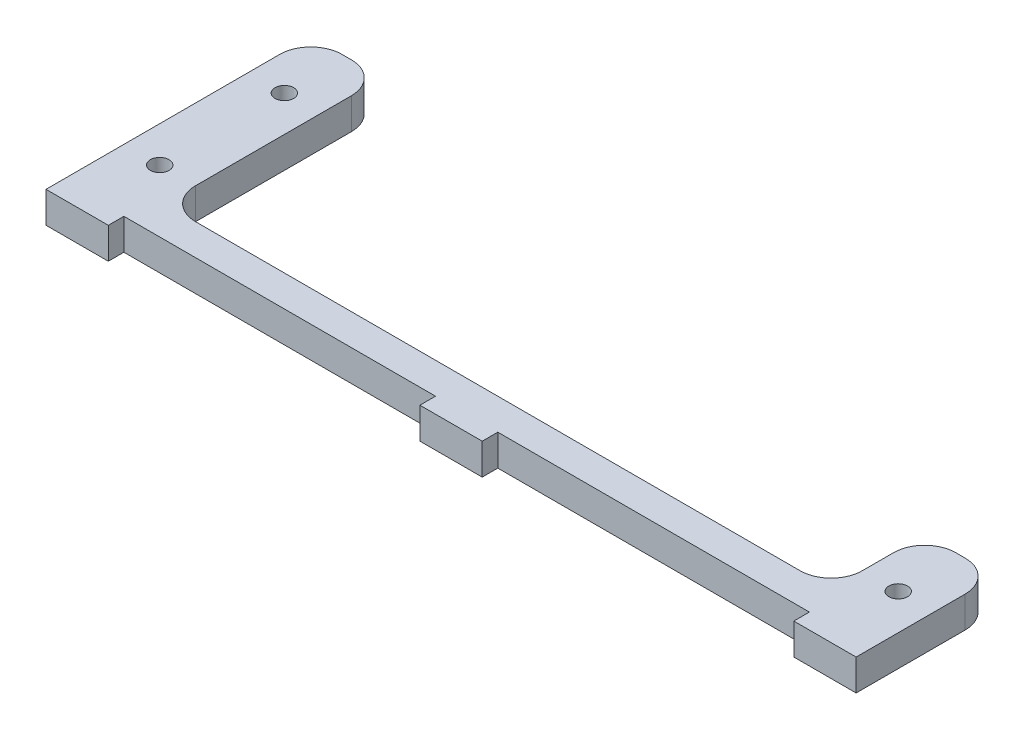
ISO-10303-21;
HEADER;
FILE_DESCRIPTION(('STEP AP214'),'2;1');
FILE_NAME('part.step','',(''),(''),'','','');
FILE_SCHEMA(('AUTOMOTIVE_DESIGN { 1 0 10303 214 1 1 1 1 }'));
ENDSEC;
DATA;
#1=APPLICATION_CONTEXT('core data for automotive mechanical design processes');
#2=APPLICATION_PROTOCOL_DEFINITION('international standard','automotive_design',2000,#1);
#3=PRODUCT_CONTEXT('',#1,'mechanical');
#4=PRODUCT('Part','Part','',(#3));
#5=PRODUCT_RELATED_PRODUCT_CATEGORY('part','',(#4));
#6=PRODUCT_DEFINITION_FORMATION('','',#4);
#7=PRODUCT_DEFINITION_CONTEXT('part definition',#1,'design');
#8=PRODUCT_DEFINITION('design','',#6,#7);
#9=PRODUCT_DEFINITION_SHAPE('','',#8);
#10=(LENGTH_UNIT() NAMED_UNIT(*) SI_UNIT(.MILLI.,.METRE.));
#11=(NAMED_UNIT(*) PLANE_ANGLE_UNIT() SI_UNIT($,.RADIAN.));
#12=(NAMED_UNIT(*) SI_UNIT($,.STERADIAN.) SOLID_ANGLE_UNIT());
#13=UNCERTAINTY_MEASURE_WITH_UNIT(LENGTH_MEASURE(1.E-05),#10,'distance_accuracy_value','');
#14=(GEOMETRIC_REPRESENTATION_CONTEXT(3) GLOBAL_UNCERTAINTY_ASSIGNED_CONTEXT((#13)) GLOBAL_UNIT_ASSIGNED_CONTEXT((#10,
#11,#12)) REPRESENTATION_CONTEXT('',''));
#15=CARTESIAN_POINT('',(0.,0.,0.));
#16=DIRECTION('',(0.,0.,1.));
#17=DIRECTION('',(1.,0.,0.));
#18=AXIS2_PLACEMENT_3D('',#15,#16,#17);
#19=CARTESIAN_POINT('',(6.35,6.35,-38.1));
#20=DIRECTION('',(0.,-1.,0.));
#21=DIRECTION('',(0.,0.,-1.));
#22=AXIS2_PLACEMENT_3D('',#19,#20,#21);
#23=PLANE('',#22);
#24=DIRECTION('',(0.,0.,1.));
#25=VECTOR('',#24,1.);
#26=CARTESIAN_POINT('',(0.,6.35,0.));
#27=LINE('',#26,#25);
#28=CARTESIAN_POINT('',(0.,6.35,-38.0999999999999));
#29=VERTEX_POINT('',#28);
#30=CARTESIAN_POINT('',(0.,6.35,9.525));
#31=VERTEX_POINT('',#30);
#32=EDGE_CURVE('E137',#29,#31,#27,.T.);
#33=ORIENTED_EDGE('',*,*,#32,.T.);
#34=DIRECTION('',(1.,0.,0.));
#35=VECTOR('',#34,1.);
#36=CARTESIAN_POINT('',(0.,6.35,9.525));
#37=LINE('',#36,#35);
#38=CARTESIAN_POINT('',(12.7,6.35,9.525));
#39=VERTEX_POINT('',#38);
#40=EDGE_CURVE('E379',#31,#39,#37,.T.);
#41=ORIENTED_EDGE('',*,*,#40,.T.);
#42=DIRECTION('',(0.,0.,-1.));
#43=VECTOR('',#42,1.);
#44=CARTESIAN_POINT('',(12.7,6.35,6.35));
#45=LINE('',#44,#43);
#46=CARTESIAN_POINT('',(12.7,6.35,6.35));
#47=VERTEX_POINT('',#46);
#48=EDGE_CURVE('E318',#39,#47,#45,.T.);
#49=ORIENTED_EDGE('',*,*,#48,.T.);
#50=DIRECTION('',(1.,0.,0.));
#51=VECTOR('',#50,1.);
#52=CARTESIAN_POINT('',(12.7,6.35,6.35));
#53=LINE('',#52,#51);
#54=CARTESIAN_POINT('',(76.2,6.35,6.35));
#55=VERTEX_POINT('',#54);
#56=EDGE_CURVE('E337',#47,#55,#53,.T.);
#57=ORIENTED_EDGE('',*,*,#56,.T.);
#58=DIRECTION('',(0.,0.,1.));
#59=VECTOR('',#58,1.);
#60=CARTESIAN_POINT('',(76.2,6.35,6.35));
#61=LINE('',#60,#59);
#62=CARTESIAN_POINT('',(76.2,6.35,9.52499999999998));
#63=VERTEX_POINT('',#62);
#64=EDGE_CURVE('E334',#55,#63,#61,.T.);
#65=ORIENTED_EDGE('',*,*,#64,.T.);
#66=DIRECTION('',(1.,0.,0.));
#67=VECTOR('',#66,1.);
#68=CARTESIAN_POINT('',(76.2,6.35,9.52499999999998));
#69=LINE('',#68,#67);
#70=CARTESIAN_POINT('',(88.9,6.35,9.52499999999998));
#71=VERTEX_POINT('',#70);
#72=EDGE_CURVE('E336',#63,#71,#69,.T.);
#73=ORIENTED_EDGE('',*,*,#72,.T.);
#74=DIRECTION('',(0.,0.,-1.));
#75=VECTOR('',#74,1.);
#76=CARTESIAN_POINT('',(88.9,6.35,6.35));
#77=LINE('',#76,#75);
#78=CARTESIAN_POINT('',(88.9,6.35,6.35));
#79=VERTEX_POINT('',#78);
#80=EDGE_CURVE('E339',#71,#79,#77,.T.);
#81=ORIENTED_EDGE('',*,*,#80,.T.);
#82=DIRECTION('',(1.,0.,0.));
#83=VECTOR('',#82,1.);
#84=CARTESIAN_POINT('',(88.9,6.35,6.35));
#85=LINE('',#84,#83);
#86=CARTESIAN_POINT('',(152.4,6.35,6.35));
#87=VERTEX_POINT('',#86);
#88=EDGE_CURVE('E345',#79,#87,#85,.T.);
#89=ORIENTED_EDGE('',*,*,#88,.T.);
#90=DIRECTION('',(0.,0.,1.));
#91=VECTOR('',#90,1.);
#92=CARTESIAN_POINT('',(152.4,6.35,6.35));
#93=LINE('',#92,#91);
#94=CARTESIAN_POINT('',(152.4,6.35,9.525));
#95=VERTEX_POINT('',#94);
#96=EDGE_CURVE('E347',#87,#95,#93,.T.);
#97=ORIENTED_EDGE('',*,*,#96,.T.);
#98=DIRECTION('',(1.,0.,0.));
#99=VECTOR('',#98,1.);
#100=CARTESIAN_POINT('',(165.1,6.35,9.525));
#101=LINE('',#100,#99);
#102=CARTESIAN_POINT('',(165.1,6.35,9.525));
#103=VERTEX_POINT('',#102);
#104=EDGE_CURVE('E349',#95,#103,#101,.T.);
#105=ORIENTED_EDGE('',*,*,#104,.T.);
#106=DIRECTION('',(0.,0.,-1.));
#107=VECTOR('',#106,1.);
#108=CARTESIAN_POINT('',(165.1,6.35,6.35));
#109=LINE('',#108,#107);
#110=CARTESIAN_POINT('',(165.1,6.35,-12.7));
#111=VERTEX_POINT('',#110);
#112=EDGE_CURVE('E351',#103,#111,#109,.T.);
#113=ORIENTED_EDGE('',*,*,#112,.T.);
#114=CARTESIAN_POINT('',(158.75,6.35,-12.7));
#115=DIRECTION('',(0.,1.,0.));
#116=DIRECTION('',(0.,0.,1.));
#117=AXIS2_PLACEMENT_3D('',#114,#115,#116);
#118=CIRCLE('',#117,6.34999999999999);
#119=CARTESIAN_POINT('',(158.75,6.35,-19.05));
#120=VERTEX_POINT('',#119);
#121=EDGE_CURVE('E353',#111,#120,#118,.T.);
#122=ORIENTED_EDGE('',*,*,#121,.T.);
#123=DIRECTION('',(-1.,0.,0.));
#124=VECTOR('',#123,1.);
#125=CARTESIAN_POINT('',(158.75,6.35,-19.05));
#126=LINE('',#125,#124);
#127=CARTESIAN_POINT('',(156.845,6.35,-19.05));
#128=VERTEX_POINT('',#127);
#129=EDGE_CURVE('E355',#120,#128,#126,.T.);
#130=ORIENTED_EDGE('',*,*,#129,.T.);
#131=CARTESIAN_POINT('',(156.845,6.35,-12.7));
#132=DIRECTION('',(0.,1.,0.));
#133=DIRECTION('',(0.,0.,1.));
#134=AXIS2_PLACEMENT_3D('',#131,#132,#133);
#135=CIRCLE('',#134,6.35);
#136=CARTESIAN_POINT('',(150.495,6.35,-12.7));
#137=VERTEX_POINT('',#136);
#138=EDGE_CURVE('E357',#128,#137,#135,.T.);
#139=ORIENTED_EDGE('',*,*,#138,.T.);
#140=DIRECTION('',(0.,0.,1.));
#141=VECTOR('',#140,1.);
#142=CARTESIAN_POINT('',(150.495,6.35,-6.35000000000004));
#143=LINE('',#142,#141);
#144=CARTESIAN_POINT('',(150.495,6.35,-6.35000000000004));
#145=VERTEX_POINT('',#144);
#146=EDGE_CURVE('E359',#137,#145,#143,.T.);
#147=ORIENTED_EDGE('',*,*,#146,.T.);
#148=CARTESIAN_POINT('',(144.145,6.35,-6.35));
#149=DIRECTION('',(0.,-1.,0.));
#150=DIRECTION('',(0.,0.,1.));
#151=AXIS2_PLACEMENT_3D('',#148,#149,#150);
#152=CIRCLE('',#151,6.35);
#153=CARTESIAN_POINT('',(144.145,6.35,0.));
#154=VERTEX_POINT('',#153);
#155=EDGE_CURVE('E361',#145,#154,#152,.T.);
#156=ORIENTED_EDGE('',*,*,#155,.T.);
#157=DIRECTION('',(-1.,0.,0.));
#158=VECTOR('',#157,1.);
#159=CARTESIAN_POINT('',(20.955,6.35,0.));
#160=LINE('',#159,#158);
#161=CARTESIAN_POINT('',(20.955,6.35,0.));
#162=VERTEX_POINT('',#161);
#163=EDGE_CURVE('E363',#154,#162,#160,.T.);
#164=ORIENTED_EDGE('',*,*,#163,.T.);
#165=CARTESIAN_POINT('',(20.955,6.35,-6.35));
#166=DIRECTION('',(0.,-1.,0.));
#167=DIRECTION('',(0.,0.,-1.));
#168=AXIS2_PLACEMENT_3D('',#165,#166,#167);
#169=CIRCLE('',#168,6.35);
#170=CARTESIAN_POINT('',(14.605,6.35,-6.35000000000004));
#171=VERTEX_POINT('',#170);
#172=EDGE_CURVE('E365',#162,#171,#169,.T.);
#173=ORIENTED_EDGE('',*,*,#172,.T.);
#174=DIRECTION('',(0.,0.,-1.));
#175=VECTOR('',#174,1.);
#176=CARTESIAN_POINT('',(14.605,6.35,-6.35000000000004));
#177=LINE('',#176,#175);
#178=CARTESIAN_POINT('',(14.605,6.35,-38.1));
#179=VERTEX_POINT('',#178);
#180=EDGE_CURVE('E199',#171,#179,#177,.T.);
#181=ORIENTED_EDGE('',*,*,#180,.T.);
#182=CARTESIAN_POINT('',(8.255,6.35,-38.1));
#183=DIRECTION('',(0.,1.,0.));
#184=DIRECTION('',(0.,0.,-1.));
#185=AXIS2_PLACEMENT_3D('',#182,#183,#184);
#186=CIRCLE('',#185,6.35);
#187=CARTESIAN_POINT('',(8.25499999999995,6.35,-44.45));
#188=VERTEX_POINT('',#187);
#189=EDGE_CURVE('E193',#179,#188,#186,.T.);
#190=ORIENTED_EDGE('',*,*,#189,.T.);
#191=DIRECTION('',(-1.,0.,0.));
#192=VECTOR('',#191,1.);
#193=CARTESIAN_POINT('',(6.35000000000004,6.35,-44.45));
#194=LINE('',#193,#192);
#195=CARTESIAN_POINT('',(6.35000000000004,6.35,-44.45));
#196=VERTEX_POINT('',#195);
#197=EDGE_CURVE('E197',#188,#196,#194,.T.);
#198=ORIENTED_EDGE('',*,*,#197,.T.);
#199=CARTESIAN_POINT('',(6.35,6.35,-38.1));
#200=DIRECTION('',(0.,1.,0.));
#201=DIRECTION('',(0.,0.,-1.));
#202=AXIS2_PLACEMENT_3D('',#199,#200,#201);
#203=CIRCLE('',#202,6.35);
#204=EDGE_CURVE('E53',#196,#29,#203,.T.);
#205=ORIENTED_EDGE('',*,*,#204,.T.);
#206=EDGE_LOOP('',(#33,#41,#49,#57,#65,#73,#81,#89,#97,#105,#113,#122,#130,#139,#147,#156,#164,
#173,#181,#190,#198,#205));
#207=FACE_BOUND('',#206,.T.);
#208=CARTESIAN_POINT('',(7.3025,6.35,-31.75));
#209=DIRECTION('',(0.,1.,0.));
#210=DIRECTION('',(0.,0.,1.));
#211=AXIS2_PLACEMENT_3D('',#208,#209,#210);
#212=CIRCLE('',#211,1.905);
#213=CARTESIAN_POINT('',(7.3025,6.35,-29.845));
#214=VERTEX_POINT('',#213);
#215=EDGE_CURVE('E219',#214,#214,#212,.T.);
#216=ORIENTED_EDGE('',*,*,#215,.F.);
#217=EDGE_LOOP('',(#216));
#218=FACE_BOUND('',#217,.T.);
#219=CARTESIAN_POINT('',(7.30249999999999,6.35,-6.35));
#220=DIRECTION('',(0.,1.,0.));
#221=DIRECTION('',(0.,0.,1.));
#222=AXIS2_PLACEMENT_3D('',#219,#220,#221);
#223=CIRCLE('',#222,1.905);
#224=CARTESIAN_POINT('',(7.30249999999999,6.35,-4.445));
#225=VERTEX_POINT('',#224);
#226=EDGE_CURVE('E655',#225,#225,#223,.T.);
#227=ORIENTED_EDGE('',*,*,#226,.F.);
#228=EDGE_LOOP('',(#227));
#229=FACE_BOUND('',#228,.T.);
#230=CARTESIAN_POINT('',(157.7975,6.35,-6.35305915290377));
#231=DIRECTION('',(0.,1.,0.));
#232=DIRECTION('',(0.,0.,1.));
#233=AXIS2_PLACEMENT_3D('',#230,#231,#232);
#234=CIRCLE('',#233,1.90499999999999);
#235=CARTESIAN_POINT('',(157.7975,6.35,-4.44805915290378));
#236=VERTEX_POINT('',#235);
#237=EDGE_CURVE('E646',#236,#236,#234,.T.);
#238=ORIENTED_EDGE('',*,*,#237,.F.);
#239=EDGE_LOOP('',(#238));
#240=FACE_BOUND('',#239,.T.);
#241=ADVANCED_FACE('F36',(#207,#218,#229,#240),#23,.F.);
#242=CARTESIAN_POINT('',(6.35,0.,-38.1));
#243=DIRECTION('',(0.,-1.,0.));
#244=DIRECTION('',(0.,0.,-1.));
#245=AXIS2_PLACEMENT_3D('',#242,#243,#244);
#246=PLANE('',#245);
#247=CARTESIAN_POINT('',(7.30249999999999,0.,-6.35));
#248=DIRECTION('',(0.,1.,0.));
#249=DIRECTION('',(0.,0.,1.));
#250=AXIS2_PLACEMENT_3D('',#247,#248,#249);
#251=CIRCLE('',#250,1.905);
#252=CARTESIAN_POINT('',(7.30249999999999,0.,-4.445));
#253=VERTEX_POINT('',#252);
#254=EDGE_CURVE('E652',#253,#253,#251,.T.);
#255=ORIENTED_EDGE('',*,*,#254,.T.);
#256=EDGE_LOOP('',(#255));
#257=FACE_BOUND('',#256,.T.);
#258=DIRECTION('',(0.,0.,1.));
#259=VECTOR('',#258,1.);
#260=CARTESIAN_POINT('',(0.,0.,6.35));
#261=LINE('',#260,#259);
#262=CARTESIAN_POINT('',(0.,0.,-38.0999999999999));
#263=VERTEX_POINT('',#262);
#264=CARTESIAN_POINT('',(0.,0.,9.525));
#265=VERTEX_POINT('',#264);
#266=EDGE_CURVE('E131',#263,#265,#261,.T.);
#267=ORIENTED_EDGE('',*,*,#266,.F.);
#268=CARTESIAN_POINT('',(6.35,0.,-38.1));
#269=DIRECTION('',(0.,1.,0.));
#270=DIRECTION('',(0.,0.,-1.));
#271=AXIS2_PLACEMENT_3D('',#268,#269,#270);
#272=CIRCLE('',#271,6.35);
#273=CARTESIAN_POINT('',(6.35000000000004,0.,-44.45));
#274=VERTEX_POINT('',#273);
#275=EDGE_CURVE('E258',#274,#263,#272,.T.);
#276=ORIENTED_EDGE('',*,*,#275,.F.);
#277=DIRECTION('',(-1.,0.,0.));
#278=VECTOR('',#277,1.);
#279=CARTESIAN_POINT('',(6.35000000000004,0.,-44.45));
#280=LINE('',#279,#278);
#281=CARTESIAN_POINT('',(8.25499999999995,0.,-44.45));
#282=VERTEX_POINT('',#281);
#283=EDGE_CURVE('E124',#282,#274,#280,.T.);
#284=ORIENTED_EDGE('',*,*,#283,.F.);
#285=CARTESIAN_POINT('',(8.255,0.,-38.1));
#286=DIRECTION('',(0.,1.,0.));
#287=DIRECTION('',(0.,0.,-1.));
#288=AXIS2_PLACEMENT_3D('',#285,#286,#287);
#289=CIRCLE('',#288,6.35);
#290=CARTESIAN_POINT('',(14.605,0.,-38.1));
#291=VERTEX_POINT('',#290);
#292=EDGE_CURVE('E207',#291,#282,#289,.T.);
#293=ORIENTED_EDGE('',*,*,#292,.F.);
#294=DIRECTION('',(0.,0.,-1.));
#295=VECTOR('',#294,1.);
#296=CARTESIAN_POINT('',(14.605,0.,-6.35000000000004));
#297=LINE('',#296,#295);
#298=CARTESIAN_POINT('',(14.605,0.,-6.35000000000004));
#299=VERTEX_POINT('',#298);
#300=EDGE_CURVE('E254',#299,#291,#297,.T.);
#301=ORIENTED_EDGE('',*,*,#300,.F.);
#302=CARTESIAN_POINT('',(20.955,0.,-6.35));
#303=DIRECTION('',(0.,-1.,0.));
#304=DIRECTION('',(0.,0.,-1.));
#305=AXIS2_PLACEMENT_3D('',#302,#303,#304);
#306=CIRCLE('',#305,6.35);
#307=CARTESIAN_POINT('',(20.955,0.,0.));
#308=VERTEX_POINT('',#307);
#309=EDGE_CURVE('E252',#308,#299,#306,.T.);
#310=ORIENTED_EDGE('',*,*,#309,.F.);
#311=DIRECTION('',(-1.,0.,0.));
#312=VECTOR('',#311,1.);
#313=CARTESIAN_POINT('',(20.955,0.,0.));
#314=LINE('',#313,#312);
#315=CARTESIAN_POINT('',(144.145,0.,0.));
#316=VERTEX_POINT('',#315);
#317=EDGE_CURVE('E250',#316,#308,#314,.T.);
#318=ORIENTED_EDGE('',*,*,#317,.F.);
#319=CARTESIAN_POINT('',(144.145,0.,-6.35));
#320=DIRECTION('',(0.,-1.,0.));
#321=DIRECTION('',(0.,0.,1.));
#322=AXIS2_PLACEMENT_3D('',#319,#320,#321);
#323=CIRCLE('',#322,6.35);
#324=CARTESIAN_POINT('',(150.495,0.,-6.35000000000004));
#325=VERTEX_POINT('',#324);
#326=EDGE_CURVE('E248',#325,#316,#323,.T.);
#327=ORIENTED_EDGE('',*,*,#326,.F.);
#328=DIRECTION('',(0.,0.,1.));
#329=VECTOR('',#328,1.);
#330=CARTESIAN_POINT('',(150.495,0.,-6.35000000000004));
#331=LINE('',#330,#329);
#332=CARTESIAN_POINT('',(150.495,0.,-12.7));
#333=VERTEX_POINT('',#332);
#334=EDGE_CURVE('E246',#333,#325,#331,.T.);
#335=ORIENTED_EDGE('',*,*,#334,.F.);
#336=CARTESIAN_POINT('',(156.845,0.,-12.7));
#337=DIRECTION('',(0.,1.,0.));
#338=DIRECTION('',(0.,0.,1.));
#339=AXIS2_PLACEMENT_3D('',#336,#337,#338);
#340=CIRCLE('',#339,6.35);
#341=CARTESIAN_POINT('',(156.845,0.,-19.05));
#342=VERTEX_POINT('',#341);
#343=EDGE_CURVE('E244',#342,#333,#340,.T.);
#344=ORIENTED_EDGE('',*,*,#343,.F.);
#345=DIRECTION('',(-1.,0.,0.));
#346=VECTOR('',#345,1.);
#347=CARTESIAN_POINT('',(158.75,0.,-19.05));
#348=LINE('',#347,#346);
#349=CARTESIAN_POINT('',(158.75,0.,-19.05));
#350=VERTEX_POINT('',#349);
#351=EDGE_CURVE('E242',#350,#342,#348,.T.);
#352=ORIENTED_EDGE('',*,*,#351,.F.);
#353=CARTESIAN_POINT('',(158.75,0.,-12.7));
#354=DIRECTION('',(0.,1.,0.));
#355=DIRECTION('',(0.,0.,1.));
#356=AXIS2_PLACEMENT_3D('',#353,#354,#355);
#357=CIRCLE('',#356,6.34999999999999);
#358=CARTESIAN_POINT('',(165.1,0.,-12.7));
#359=VERTEX_POINT('',#358);
#360=EDGE_CURVE('E240',#359,#350,#357,.T.);
#361=ORIENTED_EDGE('',*,*,#360,.F.);
#362=DIRECTION('',(0.,0.,-1.));
#363=VECTOR('',#362,1.);
#364=CARTESIAN_POINT('',(165.1,0.,0.));
#365=LINE('',#364,#363);
#366=CARTESIAN_POINT('',(165.1,0.,9.525));
#367=VERTEX_POINT('',#366);
#368=EDGE_CURVE('E238',#367,#359,#365,.T.);
#369=ORIENTED_EDGE('',*,*,#368,.F.);
#370=DIRECTION('',(1.,0.,0.));
#371=VECTOR('',#370,1.);
#372=CARTESIAN_POINT('',(165.1,0.,9.525));
#373=LINE('',#372,#371);
#374=CARTESIAN_POINT('',(152.4,0.,9.525));
#375=VERTEX_POINT('',#374);
#376=EDGE_CURVE('E235',#375,#367,#373,.T.);
#377=ORIENTED_EDGE('',*,*,#376,.F.);
#378=DIRECTION('',(0.,0.,1.));
#379=VECTOR('',#378,1.);
#380=CARTESIAN_POINT('',(152.4,0.,6.35));
#381=LINE('',#380,#379);
#382=CARTESIAN_POINT('',(152.4,0.,6.35));
#383=VERTEX_POINT('',#382);
#384=EDGE_CURVE('E233',#383,#375,#381,.T.);
#385=ORIENTED_EDGE('',*,*,#384,.F.);
#386=DIRECTION('',(1.,0.,0.));
#387=VECTOR('',#386,1.);
#388=CARTESIAN_POINT('',(88.9,0.,6.35));
#389=LINE('',#388,#387);
#390=CARTESIAN_POINT('',(88.9,0.,6.35));
#391=VERTEX_POINT('',#390);
#392=EDGE_CURVE('E231',#391,#383,#389,.T.);
#393=ORIENTED_EDGE('',*,*,#392,.F.);
#394=DIRECTION('',(0.,0.,-1.));
#395=VECTOR('',#394,1.);
#396=CARTESIAN_POINT('',(88.9,0.,6.35));
#397=LINE('',#396,#395);
#398=CARTESIAN_POINT('',(88.9,0.,9.52499999999998));
#399=VERTEX_POINT('',#398);
#400=EDGE_CURVE('E229',#399,#391,#397,.T.);
#401=ORIENTED_EDGE('',*,*,#400,.F.);
#402=DIRECTION('',(1.,0.,0.));
#403=VECTOR('',#402,1.);
#404=CARTESIAN_POINT('',(76.2,0.,9.52499999999998));
#405=LINE('',#404,#403);
#406=CARTESIAN_POINT('',(76.2,0.,9.52499999999998));
#407=VERTEX_POINT('',#406);
#408=EDGE_CURVE('E227',#407,#399,#405,.T.);
#409=ORIENTED_EDGE('',*,*,#408,.F.);
#410=DIRECTION('',(0.,0.,1.));
#411=VECTOR('',#410,1.);
#412=CARTESIAN_POINT('',(76.2,0.,6.35));
#413=LINE('',#412,#411);
#414=CARTESIAN_POINT('',(76.2,0.,6.35));
#415=VERTEX_POINT('',#414);
#416=EDGE_CURVE('E225',#415,#407,#413,.T.);
#417=ORIENTED_EDGE('',*,*,#416,.F.);
#418=DIRECTION('',(1.,0.,0.));
#419=VECTOR('',#418,1.);
#420=CARTESIAN_POINT('',(12.7,0.,6.35));
#421=LINE('',#420,#419);
#422=CARTESIAN_POINT('',(12.7,0.,6.35));
#423=VERTEX_POINT('',#422);
#424=EDGE_CURVE('E223',#423,#415,#421,.T.);
#425=ORIENTED_EDGE('',*,*,#424,.F.);
#426=DIRECTION('',(0.,0.,-1.));
#427=VECTOR('',#426,1.);
#428=CARTESIAN_POINT('',(12.7,0.,6.35));
#429=LINE('',#428,#427);
#430=CARTESIAN_POINT('',(12.7,0.,9.525));
#431=VERTEX_POINT('',#430);
#432=EDGE_CURVE('E221',#431,#423,#429,.T.);
#433=ORIENTED_EDGE('',*,*,#432,.F.);
#434=DIRECTION('',(1.,0.,0.));
#435=VECTOR('',#434,1.);
#436=CARTESIAN_POINT('',(0.,0.,9.525));
#437=LINE('',#436,#435);
#438=EDGE_CURVE('E218',#265,#431,#437,.T.);
#439=ORIENTED_EDGE('',*,*,#438,.F.);
#440=EDGE_LOOP('',(#267,#276,#284,#293,#301,#310,#318,#327,#335,#344,#352,#361,#369,#377,#385,
#393,#401,#409,#417,#425,#433,#439));
#441=FACE_BOUND('',#440,.T.);
#442=CARTESIAN_POINT('',(7.3025,0.,-31.75));
#443=DIRECTION('',(0.,1.,0.));
#444=DIRECTION('',(0.,0.,1.));
#445=AXIS2_PLACEMENT_3D('',#442,#443,#444);
#446=CIRCLE('',#445,1.905);
#447=CARTESIAN_POINT('',(7.3025,0.,-29.845));
#448=VERTEX_POINT('',#447);
#449=EDGE_CURVE('E383',#448,#448,#446,.T.);
#450=ORIENTED_EDGE('',*,*,#449,.T.);
#451=EDGE_LOOP('',(#450));
#452=FACE_BOUND('',#451,.T.);
#453=CARTESIAN_POINT('',(157.7975,0.,-6.35305915290377));
#454=DIRECTION('',(0.,1.,0.));
#455=DIRECTION('',(0.,0.,1.));
#456=AXIS2_PLACEMENT_3D('',#453,#454,#455);
#457=CIRCLE('',#456,1.90499999999999);
#458=CARTESIAN_POINT('',(157.7975,0.,-4.44805915290378));
#459=VERTEX_POINT('',#458);
#460=EDGE_CURVE('E649',#459,#459,#457,.T.);
#461=ORIENTED_EDGE('',*,*,#460,.T.);
#462=EDGE_LOOP('',(#461));
#463=FACE_BOUND('',#462,.T.);
#464=ADVANCED_FACE('F322',(#257,#441,#452,#463),#246,.T.);
#465=CARTESIAN_POINT('',(0.,6.35,6.35));
#466=DIRECTION('',(1.,0.,0.));
#467=DIRECTION('',(0.,0.,-1.));
#468=AXIS2_PLACEMENT_3D('',#465,#466,#467);
#469=PLANE('',#468);
#470=ORIENTED_EDGE('',*,*,#266,.T.);
#471=DIRECTION('',(0.,-1.,0.));
#472=VECTOR('',#471,1.);
#473=CARTESIAN_POINT('',(0.,6.35,9.525));
#474=LINE('',#473,#472);
#475=EDGE_CURVE('E11',#31,#265,#474,.T.);
#476=ORIENTED_EDGE('',*,*,#475,.F.);
#477=ORIENTED_EDGE('',*,*,#32,.F.);
#478=DIRECTION('',(0.,-1.,0.));
#479=VECTOR('',#478,1.);
#480=CARTESIAN_POINT('',(0.,6.35,-38.0999999999999));
#481=LINE('',#480,#479);
#482=EDGE_CURVE('E213',#29,#263,#481,.T.);
#483=ORIENTED_EDGE('',*,*,#482,.T.);
#484=EDGE_LOOP('',(#470,#476,#477,#483));
#485=FACE_BOUND('',#484,.T.);
#486=ADVANCED_FACE('F38',(#485),#469,.F.);
#487=CARTESIAN_POINT('',(0.,6.35,9.525));
#488=DIRECTION('',(0.,0.,-1.));
#489=DIRECTION('',(-1.,0.,0.));
#490=AXIS2_PLACEMENT_3D('',#487,#488,#489);
#491=PLANE('',#490);
#492=ORIENTED_EDGE('',*,*,#438,.T.);
#493=DIRECTION('',(0.,-1.,0.));
#494=VECTOR('',#493,1.);
#495=CARTESIAN_POINT('',(12.7,6.35,9.525));
#496=LINE('',#495,#494);
#497=EDGE_CURVE('E45',#39,#431,#496,.T.);
#498=ORIENTED_EDGE('',*,*,#497,.F.);
#499=ORIENTED_EDGE('',*,*,#40,.F.);
#500=ORIENTED_EDGE('',*,*,#475,.T.);
#501=EDGE_LOOP('',(#492,#498,#499,#500));
#502=FACE_BOUND('',#501,.T.);
#503=ADVANCED_FACE('F385',(#502),#491,.F.);
#504=CARTESIAN_POINT('',(12.7,6.35,6.35));
#505=DIRECTION('',(-1.,0.,0.));
#506=DIRECTION('',(0.,0.,1.));
#507=AXIS2_PLACEMENT_3D('',#504,#505,#506);
#508=PLANE('',#507);
#509=ORIENTED_EDGE('',*,*,#432,.T.);
#510=DIRECTION('',(0.,-1.,0.));
#511=VECTOR('',#510,1.);
#512=CARTESIAN_POINT('',(12.7,6.35,6.35));
#513=LINE('',#512,#511);
#514=EDGE_CURVE('E309',#47,#423,#513,.T.);
#515=ORIENTED_EDGE('',*,*,#514,.F.);
#516=ORIENTED_EDGE('',*,*,#48,.F.);
#517=ORIENTED_EDGE('',*,*,#497,.T.);
#518=EDGE_LOOP('',(#509,#515,#516,#517));
#519=FACE_BOUND('',#518,.T.);
#520=ADVANCED_FACE('F316',(#519),#508,.F.);
#521=CARTESIAN_POINT('',(12.7,6.35,6.35));
#522=DIRECTION('',(0.,0.,-1.));
#523=DIRECTION('',(-1.,0.,0.));
#524=AXIS2_PLACEMENT_3D('',#521,#522,#523);
#525=PLANE('',#524);
#526=ORIENTED_EDGE('',*,*,#424,.T.);
#527=DIRECTION('',(0.,-1.,0.));
#528=VECTOR('',#527,1.);
#529=CARTESIAN_POINT('',(76.2,6.35,6.35));
#530=LINE('',#529,#528);
#531=EDGE_CURVE('E306',#55,#415,#530,.T.);
#532=ORIENTED_EDGE('',*,*,#531,.F.);
#533=ORIENTED_EDGE('',*,*,#56,.F.);
#534=ORIENTED_EDGE('',*,*,#514,.T.);
#535=EDGE_LOOP('',(#526,#532,#533,#534));
#536=FACE_BOUND('',#535,.T.);
#537=ADVANCED_FACE('F328',(#536),#525,.F.);
#538=CARTESIAN_POINT('',(76.2,6.35,6.35));
#539=DIRECTION('',(1.,0.,0.));
#540=DIRECTION('',(0.,0.,-1.));
#541=AXIS2_PLACEMENT_3D('',#538,#539,#540);
#542=PLANE('',#541);
#543=ORIENTED_EDGE('',*,*,#416,.T.);
#544=DIRECTION('',(0.,-1.,0.));
#545=VECTOR('',#544,1.);
#546=CARTESIAN_POINT('',(76.2,6.35,9.52499999999998));
#547=LINE('',#546,#545);
#548=EDGE_CURVE('E303',#63,#407,#547,.T.);
#549=ORIENTED_EDGE('',*,*,#548,.F.);
#550=ORIENTED_EDGE('',*,*,#64,.F.);
#551=ORIENTED_EDGE('',*,*,#531,.T.);
#552=EDGE_LOOP('',(#543,#549,#550,#551));
#553=FACE_BOUND('',#552,.T.);
#554=ADVANCED_FACE('F332',(#553),#542,.F.);
#555=CARTESIAN_POINT('',(76.2,6.35,9.52499999999998));
#556=DIRECTION('',(0.,0.,-1.));
#557=DIRECTION('',(-1.,0.,0.));
#558=AXIS2_PLACEMENT_3D('',#555,#556,#557);
#559=PLANE('',#558);
#560=ORIENTED_EDGE('',*,*,#408,.T.);
#561=DIRECTION('',(0.,-1.,0.));
#562=VECTOR('',#561,1.);
#563=CARTESIAN_POINT('',(88.9,6.35,9.52499999999998));
#564=LINE('',#563,#562);
#565=EDGE_CURVE('E300',#71,#399,#564,.T.);
#566=ORIENTED_EDGE('',*,*,#565,.F.);
#567=ORIENTED_EDGE('',*,*,#72,.F.);
#568=ORIENTED_EDGE('',*,*,#548,.T.);
#569=EDGE_LOOP('',(#560,#566,#567,#568));
#570=FACE_BOUND('',#569,.T.);
#571=ADVANCED_FACE('F456',(#570),#559,.F.);
#572=CARTESIAN_POINT('',(88.9,6.35,6.35));
#573=DIRECTION('',(-1.,0.,0.));
#574=DIRECTION('',(0.,0.,1.));
#575=AXIS2_PLACEMENT_3D('',#572,#573,#574);
#576=PLANE('',#575);
#577=ORIENTED_EDGE('',*,*,#400,.T.);
#578=DIRECTION('',(0.,-1.,0.));
#579=VECTOR('',#578,1.);
#580=CARTESIAN_POINT('',(88.9,6.35,6.35));
#581=LINE('',#580,#579);
#582=EDGE_CURVE('E297',#79,#391,#581,.T.);
#583=ORIENTED_EDGE('',*,*,#582,.F.);
#584=ORIENTED_EDGE('',*,*,#80,.F.);
#585=ORIENTED_EDGE('',*,*,#565,.T.);
#586=EDGE_LOOP('',(#577,#583,#584,#585));
#587=FACE_BOUND('',#586,.T.);
#588=ADVANCED_FACE('F452',(#587),#576,.F.);
#589=CARTESIAN_POINT('',(88.9,6.35,6.35));
#590=DIRECTION('',(0.,0.,-1.));
#591=DIRECTION('',(-1.,0.,0.));
#592=AXIS2_PLACEMENT_3D('',#589,#590,#591);
#593=PLANE('',#592);
#594=ORIENTED_EDGE('',*,*,#392,.T.);
#595=DIRECTION('',(0.,-1.,0.));
#596=VECTOR('',#595,1.);
#597=CARTESIAN_POINT('',(152.4,6.35,6.35));
#598=LINE('',#597,#596);
#599=EDGE_CURVE('E294',#87,#383,#598,.T.);
#600=ORIENTED_EDGE('',*,*,#599,.F.);
#601=ORIENTED_EDGE('',*,*,#88,.F.);
#602=ORIENTED_EDGE('',*,*,#582,.T.);
#603=EDGE_LOOP('',(#594,#600,#601,#602));
#604=FACE_BOUND('',#603,.T.);
#605=ADVANCED_FACE('F448',(#604),#593,.F.);
#606=CARTESIAN_POINT('',(152.4,6.35,6.35));
#607=DIRECTION('',(1.,0.,0.));
#608=DIRECTION('',(0.,0.,-1.));
#609=AXIS2_PLACEMENT_3D('',#606,#607,#608);
#610=PLANE('',#609);
#611=ORIENTED_EDGE('',*,*,#384,.T.);
#612=DIRECTION('',(0.,-1.,0.));
#613=VECTOR('',#612,1.);
#614=CARTESIAN_POINT('',(152.4,6.35,9.525));
#615=LINE('',#614,#613);
#616=EDGE_CURVE('E291',#95,#375,#615,.T.);
#617=ORIENTED_EDGE('',*,*,#616,.F.);
#618=ORIENTED_EDGE('',*,*,#96,.F.);
#619=ORIENTED_EDGE('',*,*,#599,.T.);
#620=EDGE_LOOP('',(#611,#617,#618,#619));
#621=FACE_BOUND('',#620,.T.);
#622=ADVANCED_FACE('F444',(#621),#610,.F.);
#623=CARTESIAN_POINT('',(165.1,6.35,9.525));
#624=DIRECTION('',(0.,0.,-1.));
#625=DIRECTION('',(-1.,0.,0.));
#626=AXIS2_PLACEMENT_3D('',#623,#624,#625);
#627=PLANE('',#626);
#628=ORIENTED_EDGE('',*,*,#376,.T.);
#629=DIRECTION('',(0.,-1.,0.));
#630=VECTOR('',#629,1.);
#631=CARTESIAN_POINT('',(165.1,6.35,9.525));
#632=LINE('',#631,#630);
#633=EDGE_CURVE('E288',#103,#367,#632,.T.);
#634=ORIENTED_EDGE('',*,*,#633,.F.);
#635=ORIENTED_EDGE('',*,*,#104,.F.);
#636=ORIENTED_EDGE('',*,*,#616,.T.);
#637=EDGE_LOOP('',(#628,#634,#635,#636));
#638=FACE_BOUND('',#637,.T.);
#639=ADVANCED_FACE('F440',(#638),#627,.F.);
#640=CARTESIAN_POINT('',(165.1,6.35,0.));
#641=DIRECTION('',(-1.,0.,0.));
#642=DIRECTION('',(0.,0.,1.));
#643=AXIS2_PLACEMENT_3D('',#640,#641,#642);
#644=PLANE('',#643);
#645=ORIENTED_EDGE('',*,*,#368,.T.);
#646=DIRECTION('',(0.,-1.,0.));
#647=VECTOR('',#646,1.);
#648=CARTESIAN_POINT('',(165.1,6.35,-12.7));
#649=LINE('',#648,#647);
#650=EDGE_CURVE('E285',#111,#359,#649,.T.);
#651=ORIENTED_EDGE('',*,*,#650,.F.);
#652=ORIENTED_EDGE('',*,*,#112,.F.);
#653=ORIENTED_EDGE('',*,*,#633,.T.);
#654=EDGE_LOOP('',(#645,#651,#652,#653));
#655=FACE_BOUND('',#654,.T.);
#656=ADVANCED_FACE('F436',(#655),#644,.F.);
#657=CARTESIAN_POINT('',(158.75,6.35,-12.7));
#658=DIRECTION('',(0.,-1.,0.));
#659=DIRECTION('',(0.,0.,-1.));
#660=AXIS2_PLACEMENT_3D('',#657,#658,#659);
#661=CYLINDRICAL_SURFACE('',#660,6.34999999999999);
#662=ORIENTED_EDGE('',*,*,#360,.T.);
#663=DIRECTION('',(0.,-1.,0.));
#664=VECTOR('',#663,1.);
#665=CARTESIAN_POINT('',(158.75,6.35,-19.05));
#666=LINE('',#665,#664);
#667=EDGE_CURVE('E282',#120,#350,#666,.T.);
#668=ORIENTED_EDGE('',*,*,#667,.F.);
#669=ORIENTED_EDGE('',*,*,#121,.F.);
#670=ORIENTED_EDGE('',*,*,#650,.T.);
#671=EDGE_LOOP('',(#662,#668,#669,#670));
#672=FACE_BOUND('',#671,.T.);
#673=ADVANCED_FACE('F432',(#672),#661,.T.);
#674=CARTESIAN_POINT('',(158.75,6.35,-19.05));
#675=DIRECTION('',(0.,0.,1.));
#676=DIRECTION('',(1.,0.,0.));
#677=AXIS2_PLACEMENT_3D('',#674,#675,#676);
#678=PLANE('',#677);
#679=ORIENTED_EDGE('',*,*,#351,.T.);
#680=DIRECTION('',(0.,-1.,0.));
#681=VECTOR('',#680,1.);
#682=CARTESIAN_POINT('',(156.845,6.35,-19.05));
#683=LINE('',#682,#681);
#684=EDGE_CURVE('E279',#128,#342,#683,.T.);
#685=ORIENTED_EDGE('',*,*,#684,.F.);
#686=ORIENTED_EDGE('',*,*,#129,.F.);
#687=ORIENTED_EDGE('',*,*,#667,.T.);
#688=EDGE_LOOP('',(#679,#685,#686,#687));
#689=FACE_BOUND('',#688,.T.);
#690=ADVANCED_FACE('F428',(#689),#678,.F.);
#691=CARTESIAN_POINT('',(156.845,6.35,-12.7));
#692=DIRECTION('',(0.,-1.,0.));
#693=DIRECTION('',(0.,0.,-1.));
#694=AXIS2_PLACEMENT_3D('',#691,#692,#693);
#695=CYLINDRICAL_SURFACE('',#694,6.35);
#696=ORIENTED_EDGE('',*,*,#343,.T.);
#697=DIRECTION('',(0.,-1.,0.));
#698=VECTOR('',#697,1.);
#699=CARTESIAN_POINT('',(150.495,6.35,-12.7));
#700=LINE('',#699,#698);
#701=EDGE_CURVE('E276',#137,#333,#700,.T.);
#702=ORIENTED_EDGE('',*,*,#701,.F.);
#703=ORIENTED_EDGE('',*,*,#138,.F.);
#704=ORIENTED_EDGE('',*,*,#684,.T.);
#705=EDGE_LOOP('',(#696,#702,#703,#704));
#706=FACE_BOUND('',#705,.T.);
#707=ADVANCED_FACE('F424',(#706),#695,.T.);
#708=CARTESIAN_POINT('',(150.495,6.35,-6.35000000000004));
#709=DIRECTION('',(1.,0.,0.));
#710=DIRECTION('',(0.,0.,-1.));
#711=AXIS2_PLACEMENT_3D('',#708,#709,#710);
#712=PLANE('',#711);
#713=ORIENTED_EDGE('',*,*,#334,.T.);
#714=DIRECTION('',(0.,-1.,0.));
#715=VECTOR('',#714,1.);
#716=CARTESIAN_POINT('',(150.495,6.35,-6.35000000000004));
#717=LINE('',#716,#715);
#718=EDGE_CURVE('E273',#145,#325,#717,.T.);
#719=ORIENTED_EDGE('',*,*,#718,.F.);
#720=ORIENTED_EDGE('',*,*,#146,.F.);
#721=ORIENTED_EDGE('',*,*,#701,.T.);
#722=EDGE_LOOP('',(#713,#719,#720,#721));
#723=FACE_BOUND('',#722,.T.);
#724=ADVANCED_FACE('F420',(#723),#712,.F.);
#725=CARTESIAN_POINT('',(144.145,6.35,-6.35));
#726=DIRECTION('',(0.,-1.,0.));
#727=DIRECTION('',(0.,0.,-1.));
#728=AXIS2_PLACEMENT_3D('',#725,#726,#727);
#729=CYLINDRICAL_SURFACE('',#728,6.35);
#730=ORIENTED_EDGE('',*,*,#326,.T.);
#731=DIRECTION('',(0.,-1.,0.));
#732=VECTOR('',#731,1.);
#733=CARTESIAN_POINT('',(144.145,6.35,0.));
#734=LINE('',#733,#732);
#735=EDGE_CURVE('E270',#154,#316,#734,.T.);
#736=ORIENTED_EDGE('',*,*,#735,.F.);
#737=ORIENTED_EDGE('',*,*,#155,.F.);
#738=ORIENTED_EDGE('',*,*,#718,.T.);
#739=EDGE_LOOP('',(#730,#736,#737,#738));
#740=FACE_BOUND('',#739,.T.);
#741=ADVANCED_FACE('F416',(#740),#729,.F.);
#742=CARTESIAN_POINT('',(20.955,6.35,0.));
#743=DIRECTION('',(0.,0.,1.));
#744=DIRECTION('',(1.,0.,0.));
#745=AXIS2_PLACEMENT_3D('',#742,#743,#744);
#746=PLANE('',#745);
#747=ORIENTED_EDGE('',*,*,#317,.T.);
#748=DIRECTION('',(0.,-1.,0.));
#749=VECTOR('',#748,1.);
#750=CARTESIAN_POINT('',(20.955,6.35,0.));
#751=LINE('',#750,#749);
#752=EDGE_CURVE('E267',#162,#308,#751,.T.);
#753=ORIENTED_EDGE('',*,*,#752,.F.);
#754=ORIENTED_EDGE('',*,*,#163,.F.);
#755=ORIENTED_EDGE('',*,*,#735,.T.);
#756=EDGE_LOOP('',(#747,#753,#754,#755));
#757=FACE_BOUND('',#756,.T.);
#758=ADVANCED_FACE('F413',(#757),#746,.F.);
#759=CARTESIAN_POINT('',(20.955,6.35,-6.35));
#760=DIRECTION('',(0.,-1.,0.));
#761=DIRECTION('',(0.,0.,-1.));
#762=AXIS2_PLACEMENT_3D('',#759,#760,#761);
#763=CYLINDRICAL_SURFACE('',#762,6.35);
#764=ORIENTED_EDGE('',*,*,#309,.T.);
#765=DIRECTION('',(0.,-1.,0.));
#766=VECTOR('',#765,1.);
#767=CARTESIAN_POINT('',(14.605,6.35,-6.35000000000004));
#768=LINE('',#767,#766);
#769=EDGE_CURVE('E264',#171,#299,#768,.T.);
#770=ORIENTED_EDGE('',*,*,#769,.F.);
#771=ORIENTED_EDGE('',*,*,#172,.F.);
#772=ORIENTED_EDGE('',*,*,#752,.T.);
#773=EDGE_LOOP('',(#764,#770,#771,#772));
#774=FACE_BOUND('',#773,.T.);
#775=ADVANCED_FACE('F371',(#774),#763,.F.);
#776=CARTESIAN_POINT('',(14.605,6.35,-6.35000000000004));
#777=DIRECTION('',(-1.,0.,0.));
#778=DIRECTION('',(0.,0.,1.));
#779=AXIS2_PLACEMENT_3D('',#776,#777,#778);
#780=PLANE('',#779);
#781=ORIENTED_EDGE('',*,*,#300,.T.);
#782=DIRECTION('',(0.,-1.,0.));
#783=VECTOR('',#782,1.);
#784=CARTESIAN_POINT('',(14.605,6.35,-38.1));
#785=LINE('',#784,#783);
#786=EDGE_CURVE('E208',#179,#291,#785,.T.);
#787=ORIENTED_EDGE('',*,*,#786,.F.);
#788=ORIENTED_EDGE('',*,*,#180,.F.);
#789=ORIENTED_EDGE('',*,*,#769,.T.);
#790=EDGE_LOOP('',(#781,#787,#788,#789));
#791=FACE_BOUND('',#790,.T.);
#792=ADVANCED_FACE('F375',(#791),#780,.F.);
#793=CARTESIAN_POINT('',(8.255,6.35,-38.1));
#794=DIRECTION('',(0.,-1.,0.));
#795=DIRECTION('',(0.,0.,-1.));
#796=AXIS2_PLACEMENT_3D('',#793,#794,#795);
#797=CYLINDRICAL_SURFACE('',#796,6.35);
#798=ORIENTED_EDGE('',*,*,#292,.T.);
#799=DIRECTION('',(0.,-1.,0.));
#800=VECTOR('',#799,1.);
#801=CARTESIAN_POINT('',(8.25499999999995,6.35,-44.45));
#802=LINE('',#801,#800);
#803=EDGE_CURVE('E204',#188,#282,#802,.T.);
#804=ORIENTED_EDGE('',*,*,#803,.F.);
#805=ORIENTED_EDGE('',*,*,#189,.F.);
#806=ORIENTED_EDGE('',*,*,#786,.T.);
#807=EDGE_LOOP('',(#798,#804,#805,#806));
#808=FACE_BOUND('',#807,.T.);
#809=ADVANCED_FACE('F205',(#808),#797,.T.);
#810=CARTESIAN_POINT('',(6.35000000000004,6.35,-44.45));
#811=DIRECTION('',(0.,0.,1.));
#812=DIRECTION('',(1.,0.,0.));
#813=AXIS2_PLACEMENT_3D('',#810,#811,#812);
#814=PLANE('',#813);
#815=ORIENTED_EDGE('',*,*,#283,.T.);
#816=DIRECTION('',(0.,-1.,0.));
#817=VECTOR('',#816,1.);
#818=CARTESIAN_POINT('',(6.35000000000004,6.35,-44.45));
#819=LINE('',#818,#817);
#820=EDGE_CURVE('E209',#196,#274,#819,.T.);
#821=ORIENTED_EDGE('',*,*,#820,.F.);
#822=ORIENTED_EDGE('',*,*,#197,.F.);
#823=ORIENTED_EDGE('',*,*,#803,.T.);
#824=EDGE_LOOP('',(#815,#821,#822,#823));
#825=FACE_BOUND('',#824,.T.);
#826=ADVANCED_FACE('F211',(#825),#814,.F.);
#827=CARTESIAN_POINT('',(6.35,6.35,-38.1));
#828=DIRECTION('',(0.,-1.,0.));
#829=DIRECTION('',(0.,0.,-1.));
#830=AXIS2_PLACEMENT_3D('',#827,#828,#829);
#831=CYLINDRICAL_SURFACE('',#830,6.35);
#832=ORIENTED_EDGE('',*,*,#275,.T.);
#833=ORIENTED_EDGE('',*,*,#482,.F.);
#834=ORIENTED_EDGE('',*,*,#204,.F.);
#835=ORIENTED_EDGE('',*,*,#820,.T.);
#836=EDGE_LOOP('',(#832,#833,#834,#835));
#837=FACE_BOUND('',#836,.T.);
#838=ADVANCED_FACE('F377',(#837),#831,.T.);
#839=CARTESIAN_POINT('',(7.3025,6.35,-31.75));
#840=DIRECTION('',(0.,-1.,0.));
#841=DIRECTION('',(0.,0.,-1.));
#842=AXIS2_PLACEMENT_3D('',#839,#840,#841);
#843=CYLINDRICAL_SURFACE('',#842,1.905);
#844=ORIENTED_EDGE('',*,*,#215,.T.);
#845=EDGE_LOOP('',(#844));
#846=FACE_BOUND('',#845,.T.);
#847=ORIENTED_EDGE('',*,*,#449,.F.);
#848=EDGE_LOOP('',(#847));
#849=FACE_BOUND('',#848,.T.);
#850=ADVANCED_FACE('F400',(#846,#849),#843,.F.);
#851=CARTESIAN_POINT('',(7.30249999999999,6.35,-6.35));
#852=DIRECTION('',(0.,-1.,0.));
#853=DIRECTION('',(0.,0.,-1.));
#854=AXIS2_PLACEMENT_3D('',#851,#852,#853);
#855=CYLINDRICAL_SURFACE('',#854,1.905);
#856=ORIENTED_EDGE('',*,*,#226,.T.);
#857=EDGE_LOOP('',(#856));
#858=FACE_BOUND('',#857,.T.);
#859=ORIENTED_EDGE('',*,*,#254,.F.);
#860=EDGE_LOOP('',(#859));
#861=FACE_BOUND('',#860,.T.);
#862=ADVANCED_FACE('F546',(#858,#861),#855,.F.);
#863=CARTESIAN_POINT('',(157.7975,6.35,-6.35305915290377));
#864=DIRECTION('',(0.,-1.,0.));
#865=DIRECTION('',(0.,0.,-1.));
#866=AXIS2_PLACEMENT_3D('',#863,#864,#865);
#867=CYLINDRICAL_SURFACE('',#866,1.90499999999999);
#868=ORIENTED_EDGE('',*,*,#237,.T.);
#869=EDGE_LOOP('',(#868));
#870=FACE_BOUND('',#869,.T.);
#871=ORIENTED_EDGE('',*,*,#460,.F.);
#872=EDGE_LOOP('',(#871));
#873=FACE_BOUND('',#872,.T.);
#874=ADVANCED_FACE('F553',(#870,#873),#867,.F.);
#875=CLOSED_SHELL('',(#241,#464,#486,#503,#520,#537,#554,#571,#588,#605,#622,#639,#656,#673,
#690,#707,#724,#741,#758,#775,#792,#809,#826,#838,#850,#862,#874));
#876=MANIFOLD_SOLID_BREP('B2',#875);
#877=ADVANCED_BREP_SHAPE_REPRESENTATION('',(#18,#876),#14);
#878=SHAPE_DEFINITION_REPRESENTATION(#9,#877);
ENDSEC;
END-ISO-10303-21;
